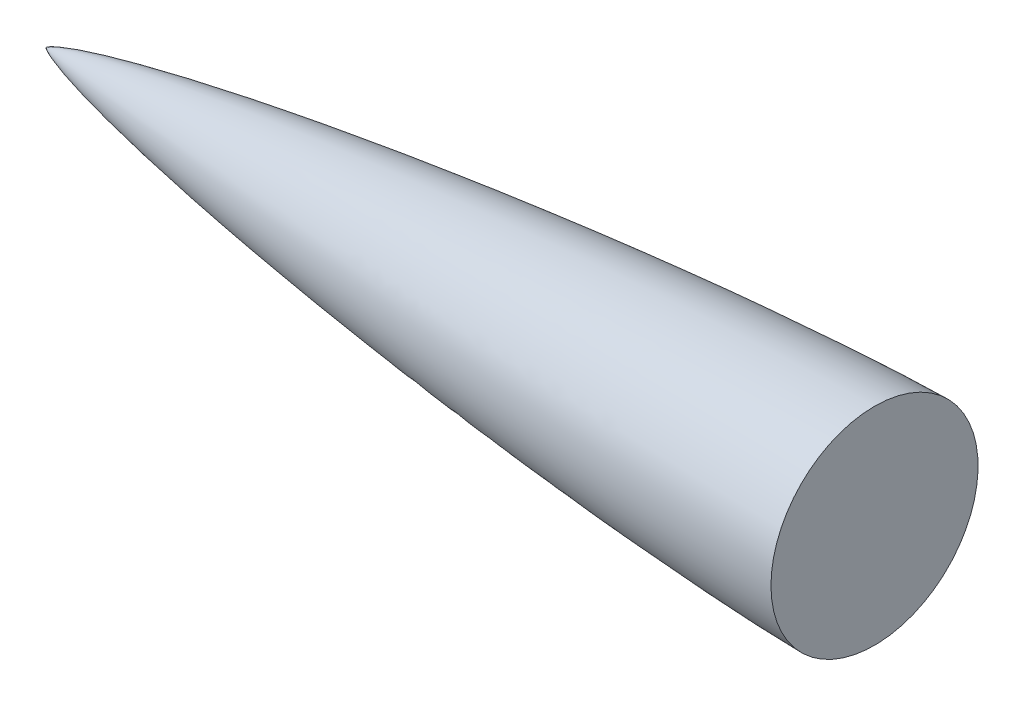
ISO-10303-21;
HEADER;
FILE_DESCRIPTION(('STEP AP214'),'2;1');
FILE_NAME('part.step','',(''),(''),'','','');
FILE_SCHEMA(('AUTOMOTIVE_DESIGN { 1 0 10303 214 1 1 1 1 }'));
ENDSEC;
DATA;
#1=APPLICATION_CONTEXT('core data for automotive mechanical design processes');
#2=APPLICATION_PROTOCOL_DEFINITION('international standard','automotive_design',2000,#1);
#3=PRODUCT_CONTEXT('',#1,'mechanical');
#4=PRODUCT('Part','Part','',(#3));
#5=PRODUCT_RELATED_PRODUCT_CATEGORY('part','',(#4));
#6=PRODUCT_DEFINITION_FORMATION('','',#4);
#7=PRODUCT_DEFINITION_CONTEXT('part definition',#1,'design');
#8=PRODUCT_DEFINITION('design','',#6,#7);
#9=PRODUCT_DEFINITION_SHAPE('','',#8);
#10=(LENGTH_UNIT() NAMED_UNIT(*) SI_UNIT(.MILLI.,.METRE.));
#11=(NAMED_UNIT(*) PLANE_ANGLE_UNIT() SI_UNIT($,.RADIAN.));
#12=(NAMED_UNIT(*) SI_UNIT($,.STERADIAN.) SOLID_ANGLE_UNIT());
#13=UNCERTAINTY_MEASURE_WITH_UNIT(LENGTH_MEASURE(1.E-05),#10,'distance_accuracy_value','');
#14=(GEOMETRIC_REPRESENTATION_CONTEXT(3) GLOBAL_UNCERTAINTY_ASSIGNED_CONTEXT((#13)) GLOBAL_UNIT_ASSIGNED_CONTEXT((#10,
#11,#12)) REPRESENTATION_CONTEXT('',''));
#15=CARTESIAN_POINT('',(0.,0.,0.));
#16=DIRECTION('',(0.,0.,1.));
#17=DIRECTION('',(1.,0.,0.));
#18=AXIS2_PLACEMENT_3D('',#15,#16,#17);
#19=CARTESIAN_POINT('',(24.,0.,0.));
#20=DIRECTION('',(-1.,0.,0.));
#21=DIRECTION('',(0.,0.,1.));
#22=AXIS2_PLACEMENT_3D('',#19,#20,#21);
#23=PLANE('',#22);
#24=CARTESIAN_POINT('',(24.,0.,0.));
#25=DIRECTION('',(-1.,0.,0.));
#26=DIRECTION('',(0.,0.,1.));
#27=AXIS2_PLACEMENT_3D('',#24,#25,#26);
#28=CIRCLE('',#27,3.);
#29=CARTESIAN_POINT('',(24.,0.,3.));
#30=VERTEX_POINT('',#29);
#31=EDGE_CURVE('E11',#30,#30,#28,.T.);
#32=ORIENTED_EDGE('',*,*,#31,.F.);
#33=EDGE_LOOP('',(#32));
#34=FACE_BOUND('',#33,.T.);
#35=ADVANCED_FACE('F39',(#34),#23,.F.);
#36=CARTESIAN_POINT('',(0.,0.,0.));
#37=CARTESIAN_POINT('',(0.00208293776689326,0.00359228224330183,0.));
#38=CARTESIAN_POINT('',(0.00695561233059715,0.00950449332468191,0.));
#39=CARTESIAN_POINT('',(0.0161214655284474,0.0164531571118544,0.));
#40=CARTESIAN_POINT('',(0.0294254321125719,0.025880744280931,0.));
#41=CARTESIAN_POINT('',(0.0463154513667512,0.0361878460358456,0.));
#42=CARTESIAN_POINT('',(0.0717906847571082,0.0503585519733198,0.));
#43=CARTESIAN_POINT('',(0.114958349022728,0.0717429672044195,0.));
#44=CARTESIAN_POINT('',(0.190618213057432,0.104930537379931,0.));
#45=CARTESIAN_POINT('',(0.328433942063841,0.157905782612758,0.));
#46=CARTESIAN_POINT('',(0.581046914324098,0.242053236691012,0.));
#47=CARTESIAN_POINT('',(1.00667216271939,0.364236675867097,0.));
#48=CARTESIAN_POINT('',(1.76256567840865,0.552096950111495,0.));
#49=CARTESIAN_POINT('',(2.82088173129991,0.777342196779798,0.));
#50=CARTESIAN_POINT('',(4.12415713847662,1.02132002691855,0.));
#51=CARTESIAN_POINT('',(5.60597698273178,1.26890324211773,0.));
#52=CARTESIAN_POINT('',(7.09120098946652,1.4948997475341,0.));
#53=CARTESIAN_POINT('',(8.57903691124107,1.70299562428656,0.));
#54=CARTESIAN_POINT('',(10.068944451857,1.89560405132819,0.));
#55=CARTESIAN_POINT('',(11.5606100871624,2.07408536496948,0.));
#56=CARTESIAN_POINT('',(13.0537956980358,2.23933959384607,0.));
#57=CARTESIAN_POINT('',(14.5483480120371,2.39172973900853,0.));
#58=CARTESIAN_POINT('',(16.0441489133052,2.53135756452726,0.));
#59=CARTESIAN_POINT('',(17.5411206896768,2.65778961902241,0.));
#60=CARTESIAN_POINT('',(19.0392082843018,2.7703601494575,0.));
#61=CARTESIAN_POINT('',(20.5383822190993,2.86734642541832,0.));
#62=CARTESIAN_POINT('',(21.9659056419845,2.94265169638689,0.));
#63=CARTESIAN_POINT('',(23.019084908232,2.98228114695787,0.));
#64=CARTESIAN_POINT('',(23.6972557530701,2.99818531354876,0.));
#65=CARTESIAN_POINT('',(24.,3.,0.));
#66=B_SPLINE_CURVE_WITH_KNOTS('',4,(#36,#37,#38,#39,#40,#41,#42,#43,#44,#45,#46,#47,#48,#49,#50,
#51,#52,#53,#54,#55,#56,#57,#58,#59,#60,#61,#62,#63,#64,#65),.UNSPECIFIED.,.F.,.F.,(5,1,1,1,1,1,
1,1,1,1,1,1,1,1,1,1,1,1,1,1,1,1,1,1,1,1,5),(0.,0.000683329781721995,0.00127157847939785,
0.00186728836473653,0.00270282317536883,0.00393843809390981,0.00608237619146408,
0.00980764830043819,0.0163266500319248,0.0282818129935763,0.0499858683145368,0.0828259126380567,
0.144771647309196,0.206717368644634,0.268663099133303,0.330608828195009,0.392554556519831,
0.454500286517446,0.516446016657176,0.578391745753678,0.64033747365908,0.702283204373752,
0.764228932895765,0.826174662912837,0.88812039140987,0.950066121749498,1.),.UNSPECIFIED.);
#67=CARTESIAN_POINT('',(0.,0.,0.));
#68=DIRECTION('',(-1.,0.,0.));
#69=AXIS1_PLACEMENT('',#67,#68);
#70=SURFACE_OF_REVOLUTION('',#66,#69);
#71=ORIENTED_EDGE('',*,*,#31,.T.);
#72=EDGE_LOOP('',(#71));
#73=FACE_BOUND('',#72,.T.);
#74=CARTESIAN_POINT('',(0.,0.,0.));
#75=VERTEX_POINT('',#74);
#76=VERTEX_LOOP('',#75);
#77=FACE_BOUND('',#76,.T.);
#78=ADVANCED_FACE('F48',(#73,#77),#70,.F.);
#79=CLOSED_SHELL('',(#35,#78));
#80=MANIFOLD_SOLID_BREP('B2',#79);
#81=ADVANCED_BREP_SHAPE_REPRESENTATION('',(#18,#80),#14);
#82=SHAPE_DEFINITION_REPRESENTATION(#9,#81);
ENDSEC;
END-ISO-10303-21;
